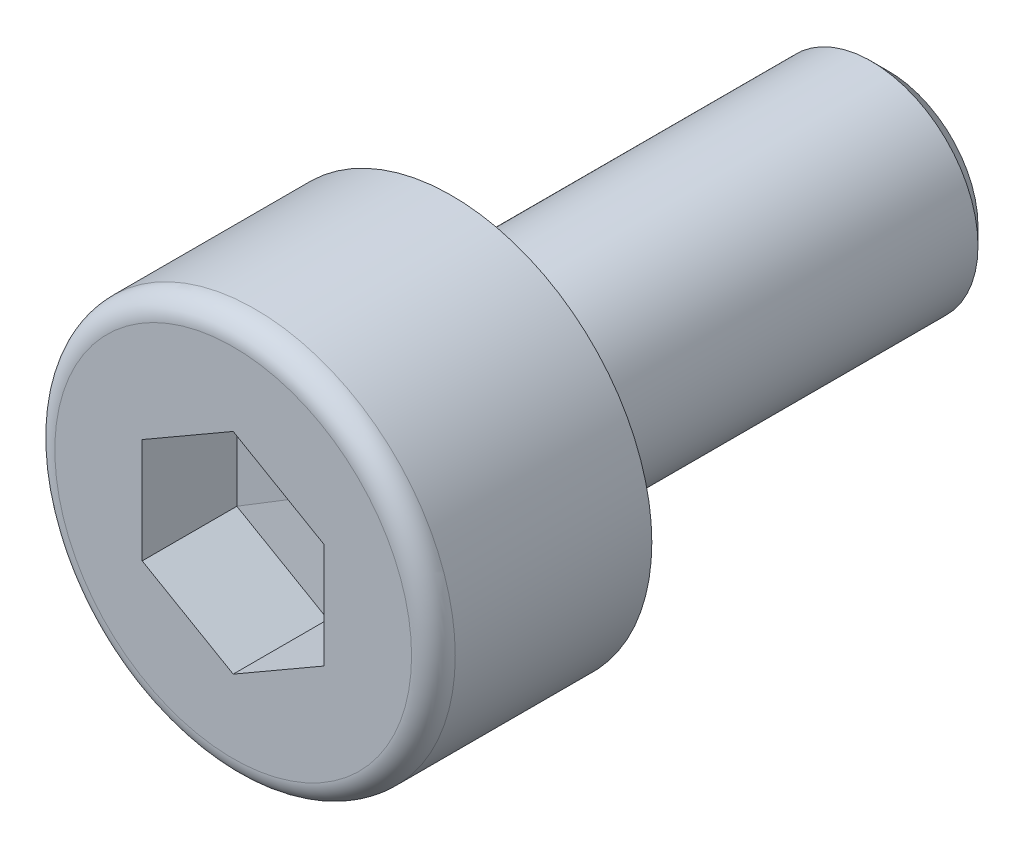
ISO-10303-21;
HEADER;
FILE_DESCRIPTION(('STEP AP214'),'2;1');
FILE_NAME('part.step','',(''),(''),'','','');
FILE_SCHEMA(('AUTOMOTIVE_DESIGN { 1 0 10303 214 1 1 1 1 }'));
ENDSEC;
DATA;
#1=APPLICATION_CONTEXT('core data for automotive mechanical design processes');
#2=APPLICATION_PROTOCOL_DEFINITION('international standard','automotive_design',2000,#1);
#3=PRODUCT_CONTEXT('',#1,'mechanical');
#4=PRODUCT('Part','Part','',(#3));
#5=PRODUCT_RELATED_PRODUCT_CATEGORY('part','',(#4));
#6=PRODUCT_DEFINITION_FORMATION('','',#4);
#7=PRODUCT_DEFINITION_CONTEXT('part definition',#1,'design');
#8=PRODUCT_DEFINITION('design','',#6,#7);
#9=PRODUCT_DEFINITION_SHAPE('','',#8);
#10=(LENGTH_UNIT() NAMED_UNIT(*) SI_UNIT(.MILLI.,.METRE.));
#11=(NAMED_UNIT(*) PLANE_ANGLE_UNIT() SI_UNIT($,.RADIAN.));
#12=(NAMED_UNIT(*) SI_UNIT($,.STERADIAN.) SOLID_ANGLE_UNIT());
#13=UNCERTAINTY_MEASURE_WITH_UNIT(LENGTH_MEASURE(1.E-05),#10,'distance_accuracy_value','');
#14=(GEOMETRIC_REPRESENTATION_CONTEXT(3) GLOBAL_UNCERTAINTY_ASSIGNED_CONTEXT((#13)) GLOBAL_UNIT_ASSIGNED_CONTEXT((#10,
#11,#12)) REPRESENTATION_CONTEXT('',''));
#15=CARTESIAN_POINT('',(0.,0.,0.));
#16=DIRECTION('',(0.,0.,1.));
#17=DIRECTION('',(1.,0.,0.));
#18=AXIS2_PLACEMENT_3D('',#15,#16,#17);
#19=CARTESIAN_POINT('',(-1.5,0.,-4.14212272371031E-13));
#20=DIRECTION('',(0.,0.,-1.));
#21=DIRECTION('',(0.,-1.,0.));
#22=AXIS2_PLACEMENT_3D('',#19,#20,#21);
#23=PLANE('',#22);
#24=CARTESIAN_POINT('',(0.,0.,-4.10227407598995E-13));
#25=DIRECTION('',(0.,0.,-1.));
#26=DIRECTION('',(-1.,0.,0.));
#27=AXIS2_PLACEMENT_3D('',#24,#25,#26);
#28=CIRCLE('',#27,1.4635);
#29=CARTESIAN_POINT('',(1.4635,0.,-4.06250735880662E-13));
#30=VERTEX_POINT('',#29);
#31=EDGE_CURVE('E11',#30,#30,#28,.T.);
#32=ORIENTED_EDGE('',*,*,#31,.F.);
#33=EDGE_LOOP('',(#32));
#34=FACE_BOUND('',#33,.T.);
#35=CARTESIAN_POINT('',(0.,0.,-7.51896096269655E-13));
#36=DIRECTION('',(0.,0.,-1.));
#37=DIRECTION('',(1.,0.,0.));
#38=AXIS2_PLACEMENT_3D('',#35,#36,#37);
#39=CIRCLE('',#38,2.75);
#40=CARTESIAN_POINT('',(2.75,0.,-7.44404538011167E-13));
#41=VERTEX_POINT('',#40);
#42=EDGE_CURVE('E138',#41,#41,#39,.T.);
#43=ORIENTED_EDGE('',*,*,#42,.T.);
#44=EDGE_LOOP('',(#43));
#45=FACE_BOUND('',#44,.T.);
#46=ADVANCED_FACE('F17',(#34,#45),#23,.T.);
#47=CARTESIAN_POINT('',(0.,0.,-6.));
#48=DIRECTION('',(0.,0.,-1.));
#49=DIRECTION('',(0.,-1.,0.));
#50=AXIS2_PLACEMENT_3D('',#47,#48,#49);
#51=PLANE('',#50);
#52=CARTESIAN_POINT('',(0.,0.,-6.));
#53=DIRECTION('',(0.,0.,-1.));
#54=DIRECTION('',(-1.,0.,0.));
#55=AXIS2_PLACEMENT_3D('',#52,#53,#54);
#56=CIRCLE('',#55,1.23);
#57=CARTESIAN_POINT('',(1.23,0.,-6.));
#58=VERTEX_POINT('',#57);
#59=EDGE_CURVE('E217',#58,#58,#56,.T.);
#60=ORIENTED_EDGE('',*,*,#59,.T.);
#61=EDGE_LOOP('',(#60));
#62=FACE_BOUND('',#61,.T.);
#63=ADVANCED_FACE('F290',(#62),#51,.T.);
#64=CARTESIAN_POINT('',(0.,0.,-3.0000000000002));
#65=DIRECTION('',(0.,0.,-1.));
#66=DIRECTION('',(-1.,0.,0.));
#67=AXIS2_PLACEMENT_3D('',#64,#65,#66);
#68=CYLINDRICAL_SURFACE('',#67,1.4635);
#69=CARTESIAN_POINT('',(0.,0.,-5.76650000000025));
#70=DIRECTION('',(0.,0.,1.));
#71=DIRECTION('',(-1.,0.,0.));
#72=AXIS2_PLACEMENT_3D('',#69,#70,#71);
#73=CIRCLE('',#72,1.4635);
#74=CARTESIAN_POINT('',(1.4635,0.,-5.76650000000025));
#75=VERTEX_POINT('',#74);
#76=EDGE_CURVE('E210',#75,#75,#73,.T.);
#77=ORIENTED_EDGE('',*,*,#76,.T.);
#78=DIRECTION('',(0.,0.,1.));
#79=VECTOR('',#78,1.);
#80=CARTESIAN_POINT('',(1.4635,0.,-3.0000000000002));
#81=LINE('',#80,#79);
#82=EDGE_CURVE('E25',#75,#30,#81,.T.);
#83=ORIENTED_EDGE('',*,*,#82,.T.);
#84=ORIENTED_EDGE('',*,*,#31,.T.);
#85=ORIENTED_EDGE('',*,*,#82,.F.);
#86=EDGE_LOOP('',(#77,#83,#84,#85));
#87=FACE_BOUND('',#86,.T.);
#88=ADVANCED_FACE('F208',(#87),#68,.T.);
#89=CARTESIAN_POINT('',(-1.25,0.721687836487032,3.));
#90=DIRECTION('',(-0.5,0.866025403784439,0.));
#91=DIRECTION('',(0.,0.,1.));
#92=AXIS2_PLACEMENT_3D('',#89,#90,#91);
#93=PLANE('',#92);
#94=DIRECTION('',(0.866025403784439,0.5,0.));
#95=VECTOR('',#94,1.);
#96=CARTESIAN_POINT('',(-1.96875,0.306717330506988,2.99999999999968));
#97=LINE('',#96,#95);
#98=CARTESIAN_POINT('',(-1.25,0.721687836487032,3.));
#99=VERTEX_POINT('',#98);
#100=CARTESIAN_POINT('',(0.,1.44337567297406,3.));
#101=VERTEX_POINT('',#100);
#102=EDGE_CURVE('E155',#99,#101,#97,.T.);
#103=ORIENTED_EDGE('',*,*,#102,.F.);
#104=DIRECTION('',(0.,0.,-1.));
#105=VECTOR('',#104,1.);
#106=CARTESIAN_POINT('',(-1.25,0.721687836487032,3.));
#107=LINE('',#106,#105);
#108=CARTESIAN_POINT('',(-1.25,0.721687836487032,1.7));
#109=VERTEX_POINT('',#108);
#110=EDGE_CURVE('E128',#99,#109,#107,.T.);
#111=ORIENTED_EDGE('',*,*,#110,.T.);
#112=DIRECTION('',(0.866025403784439,0.5,0.));
#113=VECTOR('',#112,1.);
#114=CARTESIAN_POINT('',(0.,1.44337567297406,1.7));
#115=LINE('',#114,#113);
#116=CARTESIAN_POINT('',(0.,1.44337567297406,1.7));
#117=VERTEX_POINT('',#116);
#118=EDGE_CURVE('E193',#109,#117,#115,.T.);
#119=ORIENTED_EDGE('',*,*,#118,.T.);
#120=DIRECTION('',(0.,0.,-1.));
#121=VECTOR('',#120,1.);
#122=CARTESIAN_POINT('',(0.,1.44337567297406,3.));
#123=LINE('',#122,#121);
#124=EDGE_CURVE('E44',#101,#117,#123,.T.);
#125=ORIENTED_EDGE('',*,*,#124,.F.);
#126=EDGE_LOOP('',(#103,#111,#119,#125));
#127=FACE_BOUND('',#126,.T.);
#128=ADVANCED_FACE('F249',(#127),#93,.F.);
#129=CARTESIAN_POINT('',(0.,1.44337567297406,3.));
#130=DIRECTION('',(0.5,0.866025403784438,0.));
#131=DIRECTION('',(0.,0.,-1.));
#132=AXIS2_PLACEMENT_3D('',#129,#130,#131);
#133=PLANE('',#132);
#134=DIRECTION('',(0.866025403784438,-0.5,0.));
#135=VECTOR('',#134,1.);
#136=CARTESIAN_POINT('',(-0.71875,1.85834617895411,2.99999999999969));
#137=LINE('',#136,#135);
#138=CARTESIAN_POINT('',(1.25,0.721687836487032,3.));
#139=VERTEX_POINT('',#138);
#140=EDGE_CURVE('E151',#101,#139,#137,.T.);
#141=ORIENTED_EDGE('',*,*,#140,.F.);
#142=ORIENTED_EDGE('',*,*,#124,.T.);
#143=DIRECTION('',(0.866025403784438,-0.5,0.));
#144=VECTOR('',#143,1.);
#145=CARTESIAN_POINT('',(1.25,0.721687836487032,1.7));
#146=LINE('',#145,#144);
#147=CARTESIAN_POINT('',(1.25,0.721687836487032,1.7));
#148=VERTEX_POINT('',#147);
#149=EDGE_CURVE('E161',#117,#148,#146,.T.);
#150=ORIENTED_EDGE('',*,*,#149,.T.);
#151=DIRECTION('',(0.,0.,-1.));
#152=VECTOR('',#151,1.);
#153=CARTESIAN_POINT('',(1.25,0.721687836487032,3.));
#154=LINE('',#153,#152);
#155=EDGE_CURVE('E200',#139,#148,#154,.T.);
#156=ORIENTED_EDGE('',*,*,#155,.F.);
#157=EDGE_LOOP('',(#141,#142,#150,#156));
#158=FACE_BOUND('',#157,.T.);
#159=ADVANCED_FACE('F252',(#158),#133,.F.);
#160=CARTESIAN_POINT('',(1.25,0.721687836487032,3.));
#161=DIRECTION('',(1.,0.,0.));
#162=DIRECTION('',(0.,-1.,0.));
#163=AXIS2_PLACEMENT_3D('',#160,#161,#162);
#164=PLANE('',#163);
#165=DIRECTION('',(0.,-1.,0.));
#166=VECTOR('',#165,1.);
#167=CARTESIAN_POINT('',(1.25,0.360843918243515,2.99999999999969));
#168=LINE('',#167,#166);
#169=CARTESIAN_POINT('',(1.25,-0.721687836487032,3.));
#170=VERTEX_POINT('',#169);
#171=EDGE_CURVE('E144',#139,#170,#168,.T.);
#172=ORIENTED_EDGE('',*,*,#171,.F.);
#173=ORIENTED_EDGE('',*,*,#155,.T.);
#174=DIRECTION('',(0.,-1.,0.));
#175=VECTOR('',#174,1.);
#176=CARTESIAN_POINT('',(1.25,-0.721687836487032,1.7));
#177=LINE('',#176,#175);
#178=CARTESIAN_POINT('',(1.25,-0.721687836487032,1.7));
#179=VERTEX_POINT('',#178);
#180=EDGE_CURVE('E178',#148,#179,#177,.T.);
#181=ORIENTED_EDGE('',*,*,#180,.T.);
#182=DIRECTION('',(0.,0.,-1.));
#183=VECTOR('',#182,1.);
#184=CARTESIAN_POINT('',(1.25,-0.721687836487032,3.));
#185=LINE('',#184,#183);
#186=EDGE_CURVE('E127',#170,#179,#185,.T.);
#187=ORIENTED_EDGE('',*,*,#186,.F.);
#188=EDGE_LOOP('',(#172,#173,#181,#187));
#189=FACE_BOUND('',#188,.T.);
#190=ADVANCED_FACE('F256',(#189),#164,.F.);
#191=CARTESIAN_POINT('',(1.25,-0.721687836487032,3.));
#192=DIRECTION('',(0.5,-0.866025403784439,0.));
#193=DIRECTION('',(0.,0.,-1.));
#194=AXIS2_PLACEMENT_3D('',#191,#192,#193);
#195=PLANE('',#194);
#196=DIRECTION('',(-0.866025403784439,-0.5,0.));
#197=VECTOR('',#196,1.);
#198=CARTESIAN_POINT('',(-0.093750000000003,-1.49750226071059,2.99999999999969));
#199=LINE('',#198,#197);
#200=CARTESIAN_POINT('',(0.,-1.44337567297406,3.));
#201=VERTEX_POINT('',#200);
#202=EDGE_CURVE('E119',#170,#201,#199,.T.);
#203=ORIENTED_EDGE('',*,*,#202,.F.);
#204=ORIENTED_EDGE('',*,*,#186,.T.);
#205=DIRECTION('',(-0.866025403784439,-0.5,0.));
#206=VECTOR('',#205,1.);
#207=CARTESIAN_POINT('',(0.,-1.44337567297406,1.7));
#208=LINE('',#207,#206);
#209=CARTESIAN_POINT('',(0.,-1.44337567297406,1.7));
#210=VERTEX_POINT('',#209);
#211=EDGE_CURVE('E122',#179,#210,#208,.T.);
#212=ORIENTED_EDGE('',*,*,#211,.T.);
#213=DIRECTION('',(0.,0.,-1.));
#214=VECTOR('',#213,1.);
#215=CARTESIAN_POINT('',(0.,-1.44337567297406,3.));
#216=LINE('',#215,#214);
#217=EDGE_CURVE('E115',#201,#210,#216,.T.);
#218=ORIENTED_EDGE('',*,*,#217,.F.);
#219=EDGE_LOOP('',(#203,#204,#212,#218));
#220=FACE_BOUND('',#219,.T.);
#221=ADVANCED_FACE('F117',(#220),#195,.F.);
#222=CARTESIAN_POINT('',(0.,-1.44337567297406,3.));
#223=DIRECTION('',(-0.5,-0.866025403784439,0.));
#224=DIRECTION('',(-0.866025403784439,0.5,0.));
#225=AXIS2_PLACEMENT_3D('',#222,#223,#224);
#226=PLANE('',#225);
#227=DIRECTION('',(-0.866025403784439,0.5,0.));
#228=VECTOR('',#227,1.);
#229=CARTESIAN_POINT('',(-1.34375,-0.667561248750502,2.99999999999968));
#230=LINE('',#229,#228);
#231=CARTESIAN_POINT('',(-1.25,-0.721687836487031,3.));
#232=VERTEX_POINT('',#231);
#233=EDGE_CURVE('E131',#201,#232,#230,.T.);
#234=ORIENTED_EDGE('',*,*,#233,.F.);
#235=ORIENTED_EDGE('',*,*,#217,.T.);
#236=DIRECTION('',(-0.866025403784439,0.5,0.));
#237=VECTOR('',#236,1.);
#238=CARTESIAN_POINT('',(-1.25,-0.721687836487031,1.7));
#239=LINE('',#238,#237);
#240=CARTESIAN_POINT('',(-1.25,-0.721687836487032,1.7));
#241=VERTEX_POINT('',#240);
#242=EDGE_CURVE('E174',#210,#241,#239,.T.);
#243=ORIENTED_EDGE('',*,*,#242,.T.);
#244=DIRECTION('',(0.,0.,-1.));
#245=VECTOR('',#244,1.);
#246=CARTESIAN_POINT('',(-1.25,-0.721687836487031,3.));
#247=LINE('',#246,#245);
#248=EDGE_CURVE('E133',#232,#241,#247,.T.);
#249=ORIENTED_EDGE('',*,*,#248,.F.);
#250=EDGE_LOOP('',(#234,#235,#243,#249));
#251=FACE_BOUND('',#250,.T.);
#252=ADVANCED_FACE('F132',(#251),#226,.F.);
#253=CARTESIAN_POINT('',(-1.25,-0.721687836487031,3.));
#254=DIRECTION('',(-1.,0.,0.));
#255=DIRECTION('',(0.,0.,1.));
#256=AXIS2_PLACEMENT_3D('',#253,#254,#255);
#257=PLANE('',#256);
#258=DIRECTION('',(0.,1.,0.));
#259=VECTOR('',#258,1.);
#260=CARTESIAN_POINT('',(-1.25,-0.360843918243516,2.99999999999968));
#261=LINE('',#260,#259);
#262=EDGE_CURVE('E234',#232,#99,#261,.T.);
#263=ORIENTED_EDGE('',*,*,#262,.F.);
#264=ORIENTED_EDGE('',*,*,#248,.T.);
#265=DIRECTION('',(0.,1.,0.));
#266=VECTOR('',#265,1.);
#267=CARTESIAN_POINT('',(-1.25,0.721687836487032,1.7));
#268=LINE('',#267,#266);
#269=EDGE_CURVE('E166',#241,#109,#268,.T.);
#270=ORIENTED_EDGE('',*,*,#269,.T.);
#271=ORIENTED_EDGE('',*,*,#110,.F.);
#272=EDGE_LOOP('',(#263,#264,#270,#271));
#273=FACE_BOUND('',#272,.T.);
#274=ADVANCED_FACE('F273',(#273),#257,.F.);
#275=CARTESIAN_POINT('',(0.,1.44337567297406,1.7));
#276=DIRECTION('',(-0.043577871373829,0.0754790873051733,-0.996194698091746));
#277=DIRECTION('',(-0.999044587684655,0.,0.043702537889669));
#278=AXIS2_PLACEMENT_3D('',#275,#276,#277);
#279=PLANE('',#278);
#280=DIRECTION('',(0.,-0.997141949694317,-0.0755508581011306));
#281=VECTOR('',#280,1.);
#282=CARTESIAN_POINT('',(0.,1.08459142733616,1.67281584869695));
#283=LINE('',#282,#281);
#284=CARTESIAN_POINT('',(0.,0.,1.5906391705926));
#285=VERTEX_POINT('',#284);
#286=EDGE_CURVE('E164',#117,#285,#283,.T.);
#287=ORIENTED_EDGE('',*,*,#286,.F.);
#288=ORIENTED_EDGE('',*,*,#118,.F.);
#289=DIRECTION('',(0.863550259614423,-0.498570974847159,-0.0755508581011305));
#290=VECTOR('',#289,1.);
#291=CARTESIAN_POINT('',(-0.939283728799942,0.542295713668083,1.67281584869695));
#292=LINE('',#291,#290);
#293=EDGE_CURVE('E160',#109,#285,#292,.T.);
#294=ORIENTED_EDGE('',*,*,#293,.T.);
#295=EDGE_LOOP('',(#287,#288,#294));
#296=FACE_BOUND('',#295,.T.);
#297=ADVANCED_FACE('F275',(#296),#279,.F.);
#298=CARTESIAN_POINT('',(1.25,0.721687836487032,1.7));
#299=DIRECTION('',(0.0435778713738291,0.0754790873051733,-0.996194698091746));
#300=DIRECTION('',(-0.999044587684655,0.,-0.0437025378896691));
#301=AXIS2_PLACEMENT_3D('',#298,#299,#300);
#302=PLANE('',#301);
#303=DIRECTION('',(-0.863550259614423,-0.498570974847158,-0.0755508581011305));
#304=VECTOR('',#303,1.);
#305=CARTESIAN_POINT('',(0.939283728799943,0.542295713668082,1.67281584869695));
#306=LINE('',#305,#304);
#307=EDGE_CURVE('E165',#148,#285,#306,.T.);
#308=ORIENTED_EDGE('',*,*,#307,.F.);
#309=ORIENTED_EDGE('',*,*,#149,.F.);
#310=ORIENTED_EDGE('',*,*,#286,.T.);
#311=EDGE_LOOP('',(#308,#309,#310));
#312=FACE_BOUND('',#311,.T.);
#313=ADVANCED_FACE('F283',(#312),#302,.F.);
#314=CARTESIAN_POINT('',(1.25,-0.721687836487032,1.7));
#315=DIRECTION('',(0.0871557427476581,0.,-0.996194698091746));
#316=DIRECTION('',(0.,-1.,0.));
#317=AXIS2_PLACEMENT_3D('',#314,#315,#316);
#318=PLANE('',#317);
#319=DIRECTION('',(-0.863550259614423,0.498570974847158,-0.0755508581011305));
#320=VECTOR('',#319,1.);
#321=CARTESIAN_POINT('',(0.939283728799942,-0.542295713668083,1.67281584869695));
#322=LINE('',#321,#320);
#323=EDGE_CURVE('E182',#179,#285,#322,.T.);
#324=ORIENTED_EDGE('',*,*,#323,.F.);
#325=ORIENTED_EDGE('',*,*,#180,.F.);
#326=ORIENTED_EDGE('',*,*,#307,.T.);
#327=EDGE_LOOP('',(#324,#325,#326));
#328=FACE_BOUND('',#327,.T.);
#329=ADVANCED_FACE('F260',(#328),#318,.F.);
#330=CARTESIAN_POINT('',(0.,-1.44337567297406,1.7));
#331=DIRECTION('',(0.0435778713738291,-0.0754790873051733,-0.996194698091746));
#332=DIRECTION('',(0.,-0.997141949694317,0.0755508581011305));
#333=AXIS2_PLACEMENT_3D('',#330,#331,#332);
#334=PLANE('',#333);
#335=DIRECTION('',(0.,0.997141949694317,-0.0755508581011306));
#336=VECTOR('',#335,1.);
#337=CARTESIAN_POINT('',(0.,-1.08459142733616,1.67281584869695));
#338=LINE('',#337,#336);
#339=EDGE_CURVE('E177',#210,#285,#338,.T.);
#340=ORIENTED_EDGE('',*,*,#339,.F.);
#341=ORIENTED_EDGE('',*,*,#211,.F.);
#342=ORIENTED_EDGE('',*,*,#323,.T.);
#343=EDGE_LOOP('',(#340,#341,#342));
#344=FACE_BOUND('',#343,.T.);
#345=ADVANCED_FACE('F262',(#344),#334,.F.);
#346=CARTESIAN_POINT('',(-1.25,-0.721687836487032,1.7));
#347=DIRECTION('',(-0.0435778713738291,-0.0754790873051733,-0.996194698091746));
#348=DIRECTION('',(0.,-0.997141949694317,0.0755508581011305));
#349=AXIS2_PLACEMENT_3D('',#346,#347,#348);
#350=PLANE('',#349);
#351=DIRECTION('',(0.863550259614423,0.498570974847158,-0.0755508581011305));
#352=VECTOR('',#351,1.);
#353=CARTESIAN_POINT('',(-0.939283728799943,-0.542295713668082,1.67281584869695));
#354=LINE('',#353,#352);
#355=EDGE_CURVE('E170',#241,#285,#354,.T.);
#356=ORIENTED_EDGE('',*,*,#355,.F.);
#357=ORIENTED_EDGE('',*,*,#242,.F.);
#358=ORIENTED_EDGE('',*,*,#339,.T.);
#359=EDGE_LOOP('',(#356,#357,#358));
#360=FACE_BOUND('',#359,.T.);
#361=ADVANCED_FACE('F266',(#360),#350,.F.);
#362=CARTESIAN_POINT('',(-1.25,0.721687836487032,1.7));
#363=DIRECTION('',(-0.0871557427476581,0.,-0.996194698091746));
#364=DIRECTION('',(-0.996194698091746,0.,0.0871557427476581));
#365=AXIS2_PLACEMENT_3D('',#362,#363,#364);
#366=PLANE('',#365);
#367=ORIENTED_EDGE('',*,*,#293,.F.);
#368=ORIENTED_EDGE('',*,*,#269,.F.);
#369=ORIENTED_EDGE('',*,*,#355,.T.);
#370=EDGE_LOOP('',(#367,#368,#369));
#371=FACE_BOUND('',#370,.T.);
#372=ADVANCED_FACE('F271',(#371),#366,.F.);
#373=CARTESIAN_POINT('',(0.,0.,1.49999999999947));
#374=DIRECTION('',(0.,0.,-1.));
#375=DIRECTION('',(-1.,0.,0.));
#376=AXIS2_PLACEMENT_3D('',#373,#374,#375);
#377=CYLINDRICAL_SURFACE('',#376,2.75);
#378=ORIENTED_EDGE('',*,*,#42,.F.);
#379=DIRECTION('',(0.,0.,1.));
#380=VECTOR('',#379,1.);
#381=CARTESIAN_POINT('',(2.75,0.,1.49999999999948));
#382=LINE('',#381,#380);
#383=CARTESIAN_POINT('',(2.75,0.,2.69999999999969));
#384=VERTEX_POINT('',#383);
#385=EDGE_CURVE('E157',#41,#384,#382,.T.);
#386=ORIENTED_EDGE('',*,*,#385,.T.);
#387=CARTESIAN_POINT('',(0.,0.,2.69999999999969));
#388=DIRECTION('',(0.,0.,1.));
#389=DIRECTION('',(1.,0.,0.));
#390=AXIS2_PLACEMENT_3D('',#387,#388,#389);
#391=CIRCLE('',#390,2.75);
#392=EDGE_CURVE('E224',#384,#384,#391,.T.);
#393=ORIENTED_EDGE('',*,*,#392,.F.);
#394=ORIENTED_EDGE('',*,*,#385,.F.);
#395=EDGE_LOOP('',(#378,#386,#393,#394));
#396=FACE_BOUND('',#395,.T.);
#397=ADVANCED_FACE('F345',(#396),#377,.T.);
#398=CARTESIAN_POINT('',(-2.75,0.,2.99999999999968));
#399=DIRECTION('',(0.,0.,1.));
#400=DIRECTION('',(1.,0.,0.));
#401=AXIS2_PLACEMENT_3D('',#398,#399,#400);
#402=PLANE('',#401);
#403=ORIENTED_EDGE('',*,*,#262,.T.);
#404=ORIENTED_EDGE('',*,*,#102,.T.);
#405=ORIENTED_EDGE('',*,*,#140,.T.);
#406=ORIENTED_EDGE('',*,*,#171,.T.);
#407=ORIENTED_EDGE('',*,*,#202,.T.);
#408=ORIENTED_EDGE('',*,*,#233,.T.);
#409=EDGE_LOOP('',(#403,#404,#405,#406,#407,#408));
#410=FACE_BOUND('',#409,.T.);
#411=CARTESIAN_POINT('',(0.,0.,2.99999999999969));
#412=DIRECTION('',(0.,0.,-1.));
#413=DIRECTION('',(1.,0.,0.));
#414=AXIS2_PLACEMENT_3D('',#411,#412,#413);
#415=CIRCLE('',#414,2.45);
#416=CARTESIAN_POINT('',(2.44999999999997,0.,2.99999999999969));
#417=VERTEX_POINT('',#416);
#418=EDGE_CURVE('E231',#417,#417,#415,.T.);
#419=ORIENTED_EDGE('',*,*,#418,.F.);
#420=EDGE_LOOP('',(#419));
#421=FACE_BOUND('',#420,.T.);
#422=ADVANCED_FACE('F140',(#410,#421),#402,.T.);
#423=CARTESIAN_POINT('',(0.,0.,2.69999999999969));
#424=DIRECTION('',(0.,0.,-1.));
#425=DIRECTION('',(-1.,0.,0.));
#426=AXIS2_PLACEMENT_3D('',#423,#424,#425);
#427=TOROIDAL_SURFACE('',#426,2.45,0.3);
#428=ORIENTED_EDGE('',*,*,#392,.T.);
#429=CARTESIAN_POINT('',(2.44999999999997,0.,2.69999999999969));
#430=DIRECTION('',(0.,-1.,0.));
#431=DIRECTION('',(1.,0.,0.));
#432=AXIS2_PLACEMENT_3D('',#429,#430,#431);
#433=CIRCLE('',#432,0.3);
#434=EDGE_CURVE('E235',#384,#417,#433,.T.);
#435=ORIENTED_EDGE('',*,*,#434,.T.);
#436=ORIENTED_EDGE('',*,*,#418,.T.);
#437=ORIENTED_EDGE('',*,*,#434,.F.);
#438=EDGE_LOOP('',(#428,#435,#436,#437));
#439=FACE_BOUND('',#438,.T.);
#440=ADVANCED_FACE('F353',(#439),#427,.T.);
#441=CARTESIAN_POINT('',(0.,0.,-5.85));
#442=DIRECTION('',(0.,0.,1.));
#443=DIRECTION('',(-1.,0.,0.));
#444=AXIS2_PLACEMENT_3D('',#441,#442,#443);
#445=CONICAL_SURFACE('',#444,1.38000000000016,0.785398163397961);
#446=ORIENTED_EDGE('',*,*,#76,.F.);
#447=DIRECTION('',(-0.70710678118691,0.,-0.707106781186185));
#448=VECTOR('',#447,1.);
#449=CARTESIAN_POINT('',(1.38000000000016,0.,-5.85));
#450=LINE('',#449,#448);
#451=EDGE_CURVE('E215',#75,#58,#450,.T.);
#452=ORIENTED_EDGE('',*,*,#451,.T.);
#453=ORIENTED_EDGE('',*,*,#59,.F.);
#454=ORIENTED_EDGE('',*,*,#451,.F.);
#455=EDGE_LOOP('',(#446,#452,#453,#454));
#456=FACE_BOUND('',#455,.T.);
#457=ADVANCED_FACE('F216',(#456),#445,.T.);
#458=CLOSED_SHELL('',(#46,#63,#88,#128,#159,#190,#221,#252,#274,#297,#313,#329,#345,#361,#372,
#397,#422,#440,#457));
#459=MANIFOLD_SOLID_BREP('B1',#458);
#460=ADVANCED_BREP_SHAPE_REPRESENTATION('',(#18,#459),#14);
#461=SHAPE_DEFINITION_REPRESENTATION(#9,#460);
ENDSEC;
END-ISO-10303-21;
